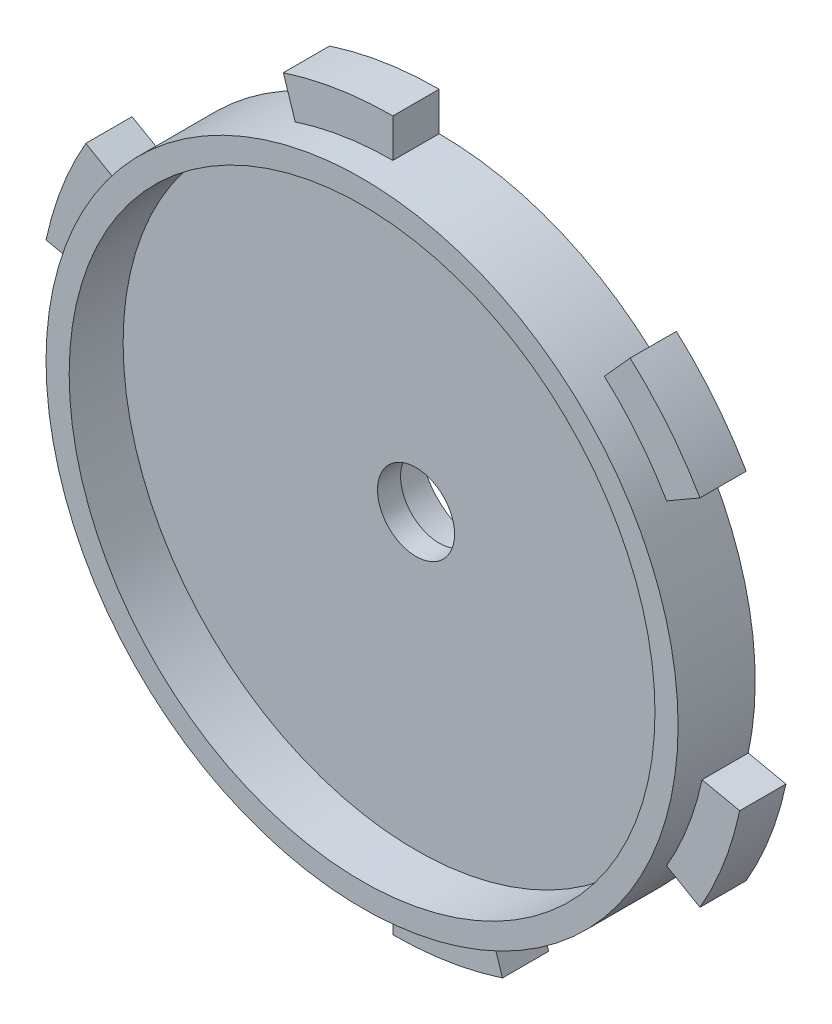
ISO-10303-21;
HEADER;
FILE_DESCRIPTION(('STEP AP214'),'2;1');
FILE_NAME('part.step','',(''),(''),'','','');
FILE_SCHEMA(('AUTOMOTIVE_DESIGN { 1 0 10303 214 1 1 1 1 }'));
ENDSEC;
DATA;
#1=APPLICATION_CONTEXT('core data for automotive mechanical design processes');
#2=APPLICATION_PROTOCOL_DEFINITION('international standard','automotive_design',2000,#1);
#3=PRODUCT_CONTEXT('',#1,'mechanical');
#4=PRODUCT('Part','Part','',(#3));
#5=PRODUCT_RELATED_PRODUCT_CATEGORY('part','',(#4));
#6=PRODUCT_DEFINITION_FORMATION('','',#4);
#7=PRODUCT_DEFINITION_CONTEXT('part definition',#1,'design');
#8=PRODUCT_DEFINITION('design','',#6,#7);
#9=PRODUCT_DEFINITION_SHAPE('','',#8);
#10=(LENGTH_UNIT() NAMED_UNIT(*) SI_UNIT(.MILLI.,.METRE.));
#11=(NAMED_UNIT(*) PLANE_ANGLE_UNIT() SI_UNIT($,.RADIAN.));
#12=(NAMED_UNIT(*) SI_UNIT($,.STERADIAN.) SOLID_ANGLE_UNIT());
#13=UNCERTAINTY_MEASURE_WITH_UNIT(LENGTH_MEASURE(1.E-05),#10,'distance_accuracy_value','');
#14=(GEOMETRIC_REPRESENTATION_CONTEXT(3) GLOBAL_UNCERTAINTY_ASSIGNED_CONTEXT((#13)) GLOBAL_UNIT_ASSIGNED_CONTEXT((#10,
#11,#12)) REPRESENTATION_CONTEXT('',''));
#15=CARTESIAN_POINT('',(0.,0.,0.));
#16=DIRECTION('',(0.,0.,1.));
#17=DIRECTION('',(1.,0.,0.));
#18=AXIS2_PLACEMENT_3D('',#15,#16,#17);
#19=CARTESIAN_POINT('',(0.,0.,0.));
#20=DIRECTION('',(0.,0.,1.));
#21=DIRECTION('',(1.,0.,0.));
#22=AXIS2_PLACEMENT_3D('',#19,#20,#21);
#23=PLANE('',#22);
#24=CARTESIAN_POINT('',(0.,0.,0.));
#25=DIRECTION('',(0.,0.,1.));
#26=DIRECTION('',(1.,0.,0.));
#27=AXIS2_PLACEMENT_3D('',#24,#25,#26);
#28=CIRCLE('',#27,5.);
#29=CARTESIAN_POINT('',(5.,0.,0.));
#30=VERTEX_POINT('',#29);
#31=EDGE_CURVE('E392',#30,#30,#28,.F.);
#32=ORIENTED_EDGE('',*,*,#31,.F.);
#33=EDGE_LOOP('',(#32));
#34=FACE_BOUND('',#33,.T.);
#35=CARTESIAN_POINT('',(0.,0.,0.));
#36=DIRECTION('',(0.,0.,-1.));
#37=DIRECTION('',(-1.,0.,0.));
#38=AXIS2_PLACEMENT_3D('',#35,#36,#37);
#39=CIRCLE('',#38,8.);
#40=CARTESIAN_POINT('',(-8.,0.,0.));
#41=VERTEX_POINT('',#40);
#42=EDGE_CURVE('E376',#41,#41,#39,.T.);
#43=ORIENTED_EDGE('',*,*,#42,.T.);
#44=EDGE_LOOP('',(#43));
#45=FACE_BOUND('',#44,.T.);
#46=ADVANCED_FACE('F37',(#34,#45),#23,.F.);
#47=CARTESIAN_POINT('',(0.,0.,10.));
#48=DIRECTION('',(0.,0.,-1.));
#49=DIRECTION('',(-1.,0.,0.));
#50=AXIS2_PLACEMENT_3D('',#47,#48,#49);
#51=CYLINDRICAL_SURFACE('',#50,41.);
#52=CARTESIAN_POINT('',(0.,0.,0.));
#53=DIRECTION('',(0.,0.,1.));
#54=DIRECTION('',(1.,0.,0.));
#55=AXIS2_PLACEMENT_3D('',#52,#53,#54);
#56=CIRCLE('',#55,41.);
#57=CARTESIAN_POINT('',(40.1040516300861,-8.52437932352774,0.));
#58=VERTEX_POINT('',#57);
#59=CARTESIAN_POINT('',(35.5070415551618,20.5000000000004,0.));
#60=VERTEX_POINT('',#59);
#61=EDGE_CURVE('E692',#58,#60,#56,.T.);
#62=ORIENTED_EDGE('',*,*,#61,.T.);
#63=DIRECTION('',(0.,0.,-1.));
#64=VECTOR('',#63,1.);
#65=CARTESIAN_POINT('',(35.5070415551617,20.5000000000004,6.));
#66=LINE('',#65,#64);
#67=CARTESIAN_POINT('',(35.5070415551617,20.5000000000004,6.));
#68=VERTEX_POINT('',#67);
#69=EDGE_CURVE('E57',#68,#60,#66,.T.);
#70=ORIENTED_EDGE('',*,*,#69,.F.);
#71=CARTESIAN_POINT('',(0.,0.,6.));
#72=DIRECTION('',(0.,0.,1.));
#73=DIRECTION('',(1.,0.,0.));
#74=AXIS2_PLACEMENT_3D('',#71,#72,#73);
#75=CIRCLE('',#74,41.);
#76=CARTESIAN_POINT('',(27.4343548607128,30.4689378445735,6.));
#77=VERTEX_POINT('',#76);
#78=EDGE_CURVE('E52',#68,#77,#75,.T.);
#79=ORIENTED_EDGE('',*,*,#78,.T.);
#80=DIRECTION('',(0.,0.,-1.));
#81=VECTOR('',#80,1.);
#82=CARTESIAN_POINT('',(27.4343548607128,30.4689378445735,6.));
#83=LINE('',#82,#81);
#84=CARTESIAN_POINT('',(27.4343548607128,30.4689378445735,0.));
#85=VERTEX_POINT('',#84);
#86=EDGE_CURVE('E209',#77,#85,#83,.T.);
#87=ORIENTED_EDGE('',*,*,#86,.T.);
#88=CARTESIAN_POINT('',(0.,41.,0.));
#89=VERTEX_POINT('',#88);
#90=EDGE_CURVE('E401',#85,#89,#56,.T.);
#91=ORIENTED_EDGE('',*,*,#90,.T.);
#92=DIRECTION('',(0.,0.,-1.));
#93=VECTOR('',#92,1.);
#94=CARTESIAN_POINT('',(0.,41.,6.));
#95=LINE('',#94,#93);
#96=CARTESIAN_POINT('',(0.,41.,6.));
#97=VERTEX_POINT('',#96);
#98=EDGE_CURVE('E373',#97,#89,#95,.T.);
#99=ORIENTED_EDGE('',*,*,#98,.F.);
#100=CARTESIAN_POINT('',(0.,0.,6.));
#101=DIRECTION('',(0.,0.,1.));
#102=DIRECTION('',(1.,0.,0.));
#103=AXIS2_PLACEMENT_3D('',#100,#101,#102);
#104=CIRCLE('',#103,41.);
#105=CARTESIAN_POINT('',(-12.6696967693729,38.9933171681013,6.));
#106=VERTEX_POINT('',#105);
#107=EDGE_CURVE('E353',#97,#106,#104,.T.);
#108=ORIENTED_EDGE('',*,*,#107,.T.);
#109=DIRECTION('',(0.,0.,-1.));
#110=VECTOR('',#109,1.);
#111=CARTESIAN_POINT('',(-12.6696967693729,38.9933171681013,6.));
#112=LINE('',#111,#110);
#113=CARTESIAN_POINT('',(-12.6696967693729,38.9933171681013,0.));
#114=VERTEX_POINT('',#113);
#115=EDGE_CURVE('E365',#106,#114,#112,.T.);
#116=ORIENTED_EDGE('',*,*,#115,.T.);
#117=CARTESIAN_POINT('',(-35.507041555162,20.5,0.));
#118=VERTEX_POINT('',#117);
#119=EDGE_CURVE('E404',#114,#118,#56,.T.);
#120=ORIENTED_EDGE('',*,*,#119,.T.);
#121=DIRECTION('',(0.,0.,-1.));
#122=VECTOR('',#121,1.);
#123=CARTESIAN_POINT('',(-35.507041555162,20.4999999999999,6.));
#124=LINE('',#123,#122);
#125=CARTESIAN_POINT('',(-35.507041555162,20.4999999999999,6.));
#126=VERTEX_POINT('',#125);
#127=EDGE_CURVE('E343',#126,#118,#124,.T.);
#128=ORIENTED_EDGE('',*,*,#127,.F.);
#129=CARTESIAN_POINT('',(0.,0.,6.));
#130=DIRECTION('',(0.,0.,1.));
#131=DIRECTION('',(1.,0.,0.));
#132=AXIS2_PLACEMENT_3D('',#129,#130,#131);
#133=CIRCLE('',#132,41.);
#134=CARTESIAN_POINT('',(-40.1040516300861,8.52437932352802,6.));
#135=VERTEX_POINT('',#134);
#136=EDGE_CURVE('E323',#126,#135,#133,.T.);
#137=ORIENTED_EDGE('',*,*,#136,.T.);
#138=DIRECTION('',(0.,0.,-1.));
#139=VECTOR('',#138,1.);
#140=CARTESIAN_POINT('',(-40.1040516300861,8.52437932352802,6.));
#141=LINE('',#140,#139);
#142=CARTESIAN_POINT('',(-40.1040516300861,8.52437932352802,0.));
#143=VERTEX_POINT('',#142);
#144=EDGE_CURVE('E335',#135,#143,#141,.T.);
#145=ORIENTED_EDGE('',*,*,#144,.T.);
#146=CARTESIAN_POINT('',(-35.5070415551619,-20.5000000000001,0.));
#147=VERTEX_POINT('',#146);
#148=EDGE_CURVE('E405',#143,#147,#56,.T.);
#149=ORIENTED_EDGE('',*,*,#148,.T.);
#150=DIRECTION('',(0.,0.,-1.));
#151=VECTOR('',#150,1.);
#152=CARTESIAN_POINT('',(-35.5070415551619,-20.5000000000002,6.));
#153=LINE('',#152,#151);
#154=CARTESIAN_POINT('',(-35.5070415551619,-20.5000000000002,6.));
#155=VERTEX_POINT('',#154);
#156=EDGE_CURVE('E313',#155,#147,#153,.T.);
#157=ORIENTED_EDGE('',*,*,#156,.F.);
#158=CARTESIAN_POINT('',(0.,0.,6.));
#159=DIRECTION('',(0.,0.,1.));
#160=DIRECTION('',(1.,0.,0.));
#161=AXIS2_PLACEMENT_3D('',#158,#159,#160);
#162=CIRCLE('',#161,41.);
#163=CARTESIAN_POINT('',(-27.434354860713,-30.4689378445733,6.));
#164=VERTEX_POINT('',#163);
#165=EDGE_CURVE('E293',#155,#164,#162,.T.);
#166=ORIENTED_EDGE('',*,*,#165,.T.);
#167=DIRECTION('',(0.,0.,-1.));
#168=VECTOR('',#167,1.);
#169=CARTESIAN_POINT('',(-27.434354860713,-30.4689378445733,6.));
#170=LINE('',#169,#168);
#171=CARTESIAN_POINT('',(-27.434354860713,-30.4689378445733,0.));
#172=VERTEX_POINT('',#171);
#173=EDGE_CURVE('E305',#164,#172,#170,.T.);
#174=ORIENTED_EDGE('',*,*,#173,.T.);
#175=CARTESIAN_POINT('',(2.86301469785137E-13,-41.,0.));
#176=VERTEX_POINT('',#175);
#177=EDGE_CURVE('E694',#172,#176,#56,.T.);
#178=ORIENTED_EDGE('',*,*,#177,.T.);
#179=DIRECTION('',(0.,0.,-1.));
#180=VECTOR('',#179,1.);
#181=CARTESIAN_POINT('',(2.86301469785137E-13,-41.,6.));
#182=LINE('',#181,#180);
#183=CARTESIAN_POINT('',(2.86301469785137E-13,-41.,6.));
#184=VERTEX_POINT('',#183);
#185=EDGE_CURVE('E283',#184,#176,#182,.T.);
#186=ORIENTED_EDGE('',*,*,#185,.F.);
#187=CARTESIAN_POINT('',(0.,0.,6.));
#188=DIRECTION('',(0.,0.,1.));
#189=DIRECTION('',(1.,0.,0.));
#190=AXIS2_PLACEMENT_3D('',#187,#188,#189);
#191=CIRCLE('',#190,41.);
#192=CARTESIAN_POINT('',(12.6696967693731,-38.9933171681012,6.));
#193=VERTEX_POINT('',#192);
#194=EDGE_CURVE('E263',#184,#193,#191,.T.);
#195=ORIENTED_EDGE('',*,*,#194,.T.);
#196=DIRECTION('',(0.,0.,-1.));
#197=VECTOR('',#196,1.);
#198=CARTESIAN_POINT('',(12.6696967693731,-38.9933171681012,6.));
#199=LINE('',#198,#197);
#200=CARTESIAN_POINT('',(12.6696967693731,-38.9933171681012,0.));
#201=VERTEX_POINT('',#200);
#202=EDGE_CURVE('E275',#193,#201,#199,.T.);
#203=ORIENTED_EDGE('',*,*,#202,.T.);
#204=CARTESIAN_POINT('',(35.5070415551622,-20.4999999999997,0.));
#205=VERTEX_POINT('',#204);
#206=EDGE_CURVE('E693',#201,#205,#56,.T.);
#207=ORIENTED_EDGE('',*,*,#206,.T.);
#208=DIRECTION('',(0.,0.,-1.));
#209=VECTOR('',#208,1.);
#210=CARTESIAN_POINT('',(35.5070415551622,-20.4999999999997,6.));
#211=LINE('',#210,#209);
#212=CARTESIAN_POINT('',(35.5070415551622,-20.4999999999997,6.));
#213=VERTEX_POINT('',#212);
#214=EDGE_CURVE('E253',#213,#205,#211,.T.);
#215=ORIENTED_EDGE('',*,*,#214,.F.);
#216=CARTESIAN_POINT('',(0.,0.,6.));
#217=DIRECTION('',(0.,0.,1.));
#218=DIRECTION('',(1.,0.,0.));
#219=AXIS2_PLACEMENT_3D('',#216,#217,#218);
#220=CIRCLE('',#219,41.);
#221=CARTESIAN_POINT('',(40.1040516300861,-8.52437932352774,6.));
#222=VERTEX_POINT('',#221);
#223=EDGE_CURVE('E233',#213,#222,#220,.T.);
#224=ORIENTED_EDGE('',*,*,#223,.T.);
#225=DIRECTION('',(0.,0.,-1.));
#226=VECTOR('',#225,1.);
#227=CARTESIAN_POINT('',(40.1040516300861,-8.52437932352774,6.));
#228=LINE('',#227,#226);
#229=EDGE_CURVE('E245',#222,#58,#228,.T.);
#230=ORIENTED_EDGE('',*,*,#229,.T.);
#231=EDGE_LOOP('',(#62,#70,#79,#87,#91,#99,#108,#116,#120,#128,#137,#145,#149,#157,#166,#174,
#178,#186,#195,#203,#207,#215,#224,#230));
#232=FACE_BOUND('',#231,.T.);
#233=CARTESIAN_POINT('',(0.,0.,10.));
#234=DIRECTION('',(0.,0.,1.));
#235=DIRECTION('',(1.,0.,0.));
#236=AXIS2_PLACEMENT_3D('',#233,#234,#235);
#237=CIRCLE('',#236,41.);
#238=CARTESIAN_POINT('',(41.,0.,10.));
#239=VERTEX_POINT('',#238);
#240=EDGE_CURVE('E45',#239,#239,#237,.T.);
#241=ORIENTED_EDGE('',*,*,#240,.F.);
#242=EDGE_LOOP('',(#241));
#243=FACE_BOUND('',#242,.T.);
#244=ADVANCED_FACE('F39',(#232,#243),#51,.T.);
#245=CARTESIAN_POINT('',(0.,0.,10.));
#246=DIRECTION('',(0.,0.,1.));
#247=DIRECTION('',(1.,0.,0.));
#248=AXIS2_PLACEMENT_3D('',#245,#246,#247);
#249=PLANE('',#248);
#250=CARTESIAN_POINT('',(0.,0.,10.));
#251=DIRECTION('',(0.,0.,1.));
#252=DIRECTION('',(1.,0.,0.));
#253=AXIS2_PLACEMENT_3D('',#250,#251,#252);
#254=CIRCLE('',#253,38.);
#255=CARTESIAN_POINT('',(38.,0.,10.));
#256=VERTEX_POINT('',#255);
#257=EDGE_CURVE('E398',#256,#256,#254,.T.);
#258=ORIENTED_EDGE('',*,*,#257,.F.);
#259=EDGE_LOOP('',(#258));
#260=FACE_BOUND('',#259,.T.);
#261=ORIENTED_EDGE('',*,*,#240,.T.);
#262=EDGE_LOOP('',(#261));
#263=FACE_BOUND('',#262,.T.);
#264=ADVANCED_FACE('F452',(#260,#263),#249,.T.);
#265=CARTESIAN_POINT('',(0.,0.,0.));
#266=DIRECTION('',(0.,0.,1.));
#267=DIRECTION('',(1.,0.,0.));
#268=AXIS2_PLACEMENT_3D('',#265,#266,#267);
#269=CIRCLE('',#268,10.);
#270=CARTESIAN_POINT('',(10.,0.,0.));
#271=VERTEX_POINT('',#270);
#272=EDGE_CURVE('E11',#271,#271,#269,.F.);
#273=ORIENTED_EDGE('',*,*,#272,.F.);
#274=EDGE_LOOP('',(#273));
#275=FACE_BOUND('',#274,.T.);
#276=ORIENTED_EDGE('',*,*,#119,.F.);
#277=DIRECTION('',(-0.309016994374948,0.951056516295153,0.));
#278=VECTOR('',#277,1.);
#279=CARTESIAN_POINT('',(-14.2147817412476,43.7485997495771,0.));
#280=LINE('',#279,#278);
#281=CARTESIAN_POINT('',(-14.2147817412476,43.7485997495771,0.));
#282=VERTEX_POINT('',#281);
#283=EDGE_CURVE('E346',#114,#282,#280,.T.);
#284=ORIENTED_EDGE('',*,*,#283,.T.);
#285=CARTESIAN_POINT('',(0.,0.,0.));
#286=DIRECTION('',(0.,0.,-1.));
#287=DIRECTION('',(1.,0.,0.));
#288=AXIS2_PLACEMENT_3D('',#285,#286,#287);
#289=CIRCLE('',#288,46.);
#290=CARTESIAN_POINT('',(0.,46.,0.));
#291=VERTEX_POINT('',#290);
#292=EDGE_CURVE('E368',#282,#291,#289,.T.);
#293=ORIENTED_EDGE('',*,*,#292,.T.);
#294=DIRECTION('',(0.,-1.,0.));
#295=VECTOR('',#294,1.);
#296=CARTESIAN_POINT('',(0.,46.,0.));
#297=LINE('',#296,#295);
#298=EDGE_CURVE('E356',#291,#89,#297,.T.);
#299=ORIENTED_EDGE('',*,*,#298,.T.);
#300=ORIENTED_EDGE('',*,*,#90,.F.);
#301=DIRECTION('',(0.66913060635885,0.743144825477402,0.));
#302=VECTOR('',#301,1.);
#303=CARTESIAN_POINT('',(30.7800078925071,34.1846619719605,0.));
#304=LINE('',#303,#302);
#305=CARTESIAN_POINT('',(30.7800078925071,34.1846619719605,0.));
#306=VERTEX_POINT('',#305);
#307=EDGE_CURVE('E224',#85,#306,#304,.T.);
#308=ORIENTED_EDGE('',*,*,#307,.T.);
#309=CARTESIAN_POINT('',(0.,0.,0.));
#310=DIRECTION('',(0.,0.,-1.));
#311=DIRECTION('',(1.,0.,0.));
#312=AXIS2_PLACEMENT_3D('',#309,#310,#311);
#313=CIRCLE('',#312,46.);
#314=CARTESIAN_POINT('',(39.8371685740839,23.0000000000005,0.));
#315=VERTEX_POINT('',#314);
#316=EDGE_CURVE('E203',#306,#315,#313,.T.);
#317=ORIENTED_EDGE('',*,*,#316,.T.);
#318=DIRECTION('',(-0.866025403784433,-0.50000000000001,0.));
#319=VECTOR('',#318,1.);
#320=CARTESIAN_POINT('',(39.8371685740839,23.0000000000005,0.));
#321=LINE('',#320,#319);
#322=EDGE_CURVE('E220',#315,#60,#321,.T.);
#323=ORIENTED_EDGE('',*,*,#322,.T.);
#324=ORIENTED_EDGE('',*,*,#61,.F.);
#325=DIRECTION('',(0.978147600733808,-0.20791169081775,0.));
#326=VECTOR('',#325,1.);
#327=CARTESIAN_POINT('',(44.9947896337552,-9.56393777761648,0.));
#328=LINE('',#327,#326);
#329=CARTESIAN_POINT('',(44.9947896337551,-9.56393777761651,0.));
#330=VERTEX_POINT('',#329);
#331=EDGE_CURVE('E230',#58,#330,#328,.T.);
#332=ORIENTED_EDGE('',*,*,#331,.T.);
#333=CARTESIAN_POINT('',(0.,0.,0.));
#334=DIRECTION('',(0.,0.,-1.));
#335=DIRECTION('',(1.,0.,0.));
#336=AXIS2_PLACEMENT_3D('',#333,#334,#335);
#337=CIRCLE('',#336,46.);
#338=CARTESIAN_POINT('',(39.8371685740844,-22.9999999999996,0.));
#339=VERTEX_POINT('',#338);
#340=EDGE_CURVE('E248',#330,#339,#337,.T.);
#341=ORIENTED_EDGE('',*,*,#340,.T.);
#342=DIRECTION('',(-0.866025403784443,0.499999999999992,0.));
#343=VECTOR('',#342,1.);
#344=CARTESIAN_POINT('',(39.8371685740844,-22.9999999999996,0.));
#345=LINE('',#344,#343);
#346=EDGE_CURVE('E236',#339,#205,#345,.T.);
#347=ORIENTED_EDGE('',*,*,#346,.T.);
#348=ORIENTED_EDGE('',*,*,#206,.F.);
#349=DIRECTION('',(0.309016994374955,-0.951056516295151,0.));
#350=VECTOR('',#349,1.);
#351=CARTESIAN_POINT('',(14.2147817412479,-43.748599749577,0.));
#352=LINE('',#351,#350);
#353=CARTESIAN_POINT('',(14.2147817412479,-43.748599749577,0.));
#354=VERTEX_POINT('',#353);
#355=EDGE_CURVE('E256',#201,#354,#352,.T.);
#356=ORIENTED_EDGE('',*,*,#355,.T.);
#357=CARTESIAN_POINT('',(0.,0.,0.));
#358=DIRECTION('',(0.,0.,-1.));
#359=DIRECTION('',(1.,0.,0.));
#360=AXIS2_PLACEMENT_3D('',#357,#358,#359);
#361=CIRCLE('',#360,46.);
#362=CARTESIAN_POINT('',(3.21216283173568E-13,-46.,0.));
#363=VERTEX_POINT('',#362);
#364=EDGE_CURVE('E278',#354,#363,#361,.T.);
#365=ORIENTED_EDGE('',*,*,#364,.T.);
#366=DIRECTION('',(0.,1.,0.));
#367=VECTOR('',#366,1.);
#368=CARTESIAN_POINT('',(3.21216283173568E-13,-46.,0.));
#369=LINE('',#368,#367);
#370=EDGE_CURVE('E266',#363,#176,#369,.T.);
#371=ORIENTED_EDGE('',*,*,#370,.T.);
#372=ORIENTED_EDGE('',*,*,#177,.F.);
#373=DIRECTION('',(-0.669130606358855,-0.743144825477397,0.));
#374=VECTOR('',#373,1.);
#375=CARTESIAN_POINT('',(-30.7800078925073,-34.1846619719603,0.));
#376=LINE('',#375,#374);
#377=CARTESIAN_POINT('',(-30.7800078925073,-34.1846619719603,0.));
#378=VERTEX_POINT('',#377);
#379=EDGE_CURVE('E286',#172,#378,#376,.T.);
#380=ORIENTED_EDGE('',*,*,#379,.T.);
#381=CARTESIAN_POINT('',(0.,0.,0.));
#382=DIRECTION('',(0.,0.,-1.));
#383=DIRECTION('',(1.,0.,0.));
#384=AXIS2_PLACEMENT_3D('',#381,#382,#383);
#385=CIRCLE('',#384,46.);
#386=CARTESIAN_POINT('',(-39.8371685740841,-23.0000000000002,0.));
#387=VERTEX_POINT('',#386);
#388=EDGE_CURVE('E308',#378,#387,#385,.T.);
#389=ORIENTED_EDGE('',*,*,#388,.T.);
#390=DIRECTION('',(0.866025403784437,0.500000000000004,0.));
#391=VECTOR('',#390,1.);
#392=CARTESIAN_POINT('',(-39.8371685740841,-23.0000000000002,0.));
#393=LINE('',#392,#391);
#394=EDGE_CURVE('E296',#387,#147,#393,.T.);
#395=ORIENTED_EDGE('',*,*,#394,.T.);
#396=ORIENTED_EDGE('',*,*,#148,.F.);
#397=DIRECTION('',(-0.978147600733806,0.207911690817756,0.));
#398=VECTOR('',#397,1.);
#399=CARTESIAN_POINT('',(-44.9947896337551,9.5639377776168,0.));
#400=LINE('',#399,#398);
#401=CARTESIAN_POINT('',(-44.9947896337551,9.56393777761679,0.));
#402=VERTEX_POINT('',#401);
#403=EDGE_CURVE('E316',#143,#402,#400,.T.);
#404=ORIENTED_EDGE('',*,*,#403,.T.);
#405=CARTESIAN_POINT('',(0.,0.,0.));
#406=DIRECTION('',(0.,0.,-1.));
#407=DIRECTION('',(1.,0.,0.));
#408=AXIS2_PLACEMENT_3D('',#405,#406,#407);
#409=CIRCLE('',#408,46.);
#410=CARTESIAN_POINT('',(-39.8371685740842,22.9999999999999,0.));
#411=VERTEX_POINT('',#410);
#412=EDGE_CURVE('E338',#402,#411,#409,.T.);
#413=ORIENTED_EDGE('',*,*,#412,.T.);
#414=DIRECTION('',(0.866025403784439,-0.499999999999999,0.));
#415=VECTOR('',#414,1.);
#416=CARTESIAN_POINT('',(-39.8371685740842,22.9999999999999,0.));
#417=LINE('',#416,#415);
#418=EDGE_CURVE('E326',#411,#118,#417,.T.);
#419=ORIENTED_EDGE('',*,*,#418,.T.);
#420=EDGE_LOOP('',(#276,#284,#293,#299,#300,#308,#317,#323,#324,#332,#341,#347,#348,#356,#365,
#371,#372,#380,#389,#395,#396,#404,#413,#419));
#421=FACE_BOUND('',#420,.T.);
#422=ADVANCED_FACE('F421',(#275,#421),#23,.F.);
#423=CARTESIAN_POINT('',(0.,0.,10.));
#424=DIRECTION('',(0.,0.,-1.));
#425=DIRECTION('',(-1.,0.,0.));
#426=AXIS2_PLACEMENT_3D('',#423,#424,#425);
#427=CYLINDRICAL_SURFACE('',#426,38.);
#428=ORIENTED_EDGE('',*,*,#257,.T.);
#429=EDGE_LOOP('',(#428));
#430=FACE_BOUND('',#429,.T.);
#431=CARTESIAN_POINT('',(0.,0.,3.));
#432=DIRECTION('',(0.,0.,1.));
#433=DIRECTION('',(1.,0.,0.));
#434=AXIS2_PLACEMENT_3D('',#431,#432,#433);
#435=CIRCLE('',#434,38.);
#436=CARTESIAN_POINT('',(38.,0.,3.));
#437=VERTEX_POINT('',#436);
#438=EDGE_CURVE('E395',#437,#437,#435,.T.);
#439=ORIENTED_EDGE('',*,*,#438,.F.);
#440=EDGE_LOOP('',(#439));
#441=FACE_BOUND('',#440,.T.);
#442=ADVANCED_FACE('F446',(#430,#441),#427,.F.);
#443=CARTESIAN_POINT('',(0.,0.,3.));
#444=DIRECTION('',(0.,0.,1.));
#445=DIRECTION('',(1.,0.,0.));
#446=AXIS2_PLACEMENT_3D('',#443,#444,#445);
#447=PLANE('',#446);
#448=CARTESIAN_POINT('',(0.,0.,3.));
#449=DIRECTION('',(0.,0.,1.));
#450=DIRECTION('',(1.,0.,0.));
#451=AXIS2_PLACEMENT_3D('',#448,#449,#450);
#452=CIRCLE('',#451,5.);
#453=CARTESIAN_POINT('',(5.,0.,3.));
#454=VERTEX_POINT('',#453);
#455=EDGE_CURVE('E391',#454,#454,#452,.F.);
#456=ORIENTED_EDGE('',*,*,#455,.T.);
#457=EDGE_LOOP('',(#456));
#458=FACE_BOUND('',#457,.T.);
#459=ORIENTED_EDGE('',*,*,#438,.T.);
#460=EDGE_LOOP('',(#459));
#461=FACE_BOUND('',#460,.T.);
#462=ADVANCED_FACE('F409',(#458,#461),#447,.T.);
#463=CARTESIAN_POINT('',(0.,0.,10.));
#464=DIRECTION('',(0.,0.,-1.));
#465=DIRECTION('',(-1.,0.,0.));
#466=AXIS2_PLACEMENT_3D('',#463,#464,#465);
#467=CYLINDRICAL_SURFACE('',#466,5.);
#468=ORIENTED_EDGE('',*,*,#455,.F.);
#469=EDGE_LOOP('',(#468));
#470=FACE_BOUND('',#469,.T.);
#471=ORIENTED_EDGE('',*,*,#31,.T.);
#472=EDGE_LOOP('',(#471));
#473=FACE_BOUND('',#472,.T.);
#474=ADVANCED_FACE('F412',(#470,#473),#467,.F.);
#475=CARTESIAN_POINT('',(0.,0.,-5.5));
#476=DIRECTION('',(0.,0.,-1.));
#477=DIRECTION('',(-1.,0.,0.));
#478=AXIS2_PLACEMENT_3D('',#475,#476,#477);
#479=PLANE('',#478);
#480=CARTESIAN_POINT('',(0.,0.,-5.5));
#481=DIRECTION('',(0.,0.,-1.));
#482=DIRECTION('',(-1.,0.,0.));
#483=AXIS2_PLACEMENT_3D('',#480,#481,#482);
#484=CIRCLE('',#483,10.);
#485=CARTESIAN_POINT('',(-10.,0.,-5.5));
#486=VERTEX_POINT('',#485);
#487=EDGE_CURVE('E386',#486,#486,#484,.T.);
#488=ORIENTED_EDGE('',*,*,#487,.T.);
#489=EDGE_LOOP('',(#488));
#490=FACE_BOUND('',#489,.T.);
#491=CARTESIAN_POINT('',(0.,0.,-5.5));
#492=DIRECTION('',(0.,0.,-1.));
#493=DIRECTION('',(-1.,0.,0.));
#494=AXIS2_PLACEMENT_3D('',#491,#492,#493);
#495=CIRCLE('',#494,8.);
#496=CARTESIAN_POINT('',(-8.,0.,-5.5));
#497=VERTEX_POINT('',#496);
#498=EDGE_CURVE('E383',#497,#497,#495,.T.);
#499=ORIENTED_EDGE('',*,*,#498,.F.);
#500=EDGE_LOOP('',(#499));
#501=FACE_BOUND('',#500,.T.);
#502=ADVANCED_FACE('F415',(#490,#501),#479,.T.);
#503=CARTESIAN_POINT('',(0.,0.,-5.5));
#504=DIRECTION('',(0.,0.,1.));
#505=DIRECTION('',(1.,0.,0.));
#506=AXIS2_PLACEMENT_3D('',#503,#504,#505);
#507=CYLINDRICAL_SURFACE('',#506,10.);
#508=ORIENTED_EDGE('',*,*,#487,.F.);
#509=EDGE_LOOP('',(#508));
#510=FACE_BOUND('',#509,.T.);
#511=ORIENTED_EDGE('',*,*,#272,.T.);
#512=EDGE_LOOP('',(#511));
#513=FACE_BOUND('',#512,.T.);
#514=ADVANCED_FACE('F427',(#510,#513),#507,.T.);
#515=CARTESIAN_POINT('',(0.,0.,-5.5));
#516=DIRECTION('',(0.,0.,1.));
#517=DIRECTION('',(1.,0.,0.));
#518=AXIS2_PLACEMENT_3D('',#515,#516,#517);
#519=CYLINDRICAL_SURFACE('',#518,8.);
#520=ORIENTED_EDGE('',*,*,#498,.T.);
#521=EDGE_LOOP('',(#520));
#522=FACE_BOUND('',#521,.T.);
#523=ORIENTED_EDGE('',*,*,#42,.F.);
#524=EDGE_LOOP('',(#523));
#525=FACE_BOUND('',#524,.T.);
#526=ADVANCED_FACE('F424',(#522,#525),#519,.F.);
#527=CARTESIAN_POINT('',(0.,46.,6.));
#528=DIRECTION('',(1.,0.,0.));
#529=DIRECTION('',(0.,0.,-1.));
#530=AXIS2_PLACEMENT_3D('',#527,#528,#529);
#531=PLANE('',#530);
#532=ORIENTED_EDGE('',*,*,#298,.F.);
#533=DIRECTION('',(0.,0.,-1.));
#534=VECTOR('',#533,1.);
#535=CARTESIAN_POINT('',(0.,46.,6.));
#536=LINE('',#535,#534);
#537=CARTESIAN_POINT('',(0.,46.,6.));
#538=VERTEX_POINT('',#537);
#539=EDGE_CURVE('E377',#538,#291,#536,.T.);
#540=ORIENTED_EDGE('',*,*,#539,.F.);
#541=DIRECTION('',(0.,-1.,0.));
#542=VECTOR('',#541,1.);
#543=CARTESIAN_POINT('',(0.,46.,6.));
#544=LINE('',#543,#542);
#545=EDGE_CURVE('E362',#538,#97,#544,.T.);
#546=ORIENTED_EDGE('',*,*,#545,.T.);
#547=ORIENTED_EDGE('',*,*,#98,.T.);
#548=EDGE_LOOP('',(#532,#540,#546,#547));
#549=FACE_BOUND('',#548,.T.);
#550=ADVANCED_FACE('F426',(#549),#531,.T.);
#551=CARTESIAN_POINT('',(0.,0.,6.));
#552=DIRECTION('',(0.,0.,-1.));
#553=DIRECTION('',(-1.,0.,0.));
#554=AXIS2_PLACEMENT_3D('',#551,#552,#553);
#555=CYLINDRICAL_SURFACE('',#554,46.);
#556=ORIENTED_EDGE('',*,*,#292,.F.);
#557=DIRECTION('',(0.,0.,-1.));
#558=VECTOR('',#557,1.);
#559=CARTESIAN_POINT('',(-14.2147817412476,43.7485997495771,6.));
#560=LINE('',#559,#558);
#561=CARTESIAN_POINT('',(-14.2147817412476,43.7485997495771,6.));
#562=VERTEX_POINT('',#561);
#563=EDGE_CURVE('E379',#562,#282,#560,.T.);
#564=ORIENTED_EDGE('',*,*,#563,.F.);
#565=CARTESIAN_POINT('',(0.,0.,6.));
#566=DIRECTION('',(0.,0.,-1.));
#567=DIRECTION('',(1.,0.,0.));
#568=AXIS2_PLACEMENT_3D('',#565,#566,#567);
#569=CIRCLE('',#568,46.);
#570=EDGE_CURVE('E359',#562,#538,#569,.T.);
#571=ORIENTED_EDGE('',*,*,#570,.T.);
#572=ORIENTED_EDGE('',*,*,#539,.T.);
#573=EDGE_LOOP('',(#556,#564,#571,#572));
#574=FACE_BOUND('',#573,.T.);
#575=ADVANCED_FACE('F434',(#574),#555,.T.);
#576=CARTESIAN_POINT('',(-14.2147817412476,43.7485997495771,6.));
#577=DIRECTION('',(-0.951056516295153,-0.309016994374948,0.));
#578=DIRECTION('',(0.309016994374948,-0.951056516295153,0.));
#579=AXIS2_PLACEMENT_3D('',#576,#577,#578);
#580=PLANE('',#579);
#581=ORIENTED_EDGE('',*,*,#283,.F.);
#582=ORIENTED_EDGE('',*,*,#115,.F.);
#583=DIRECTION('',(-0.309016994374948,0.951056516295153,0.));
#584=VECTOR('',#583,1.);
#585=CARTESIAN_POINT('',(-14.2147817412476,43.7485997495771,6.));
#586=LINE('',#585,#584);
#587=EDGE_CURVE('E355',#106,#562,#586,.T.);
#588=ORIENTED_EDGE('',*,*,#587,.T.);
#589=ORIENTED_EDGE('',*,*,#563,.T.);
#590=EDGE_LOOP('',(#581,#582,#588,#589));
#591=FACE_BOUND('',#590,.T.);
#592=ADVANCED_FACE('F441',(#591),#580,.T.);
#593=CARTESIAN_POINT('',(0.,0.,6.));
#594=DIRECTION('',(0.,0.,1.));
#595=DIRECTION('',(1.,0.,0.));
#596=AXIS2_PLACEMENT_3D('',#593,#594,#595);
#597=PLANE('',#596);
#598=ORIENTED_EDGE('',*,*,#107,.F.);
#599=ORIENTED_EDGE('',*,*,#545,.F.);
#600=ORIENTED_EDGE('',*,*,#570,.F.);
#601=ORIENTED_EDGE('',*,*,#587,.F.);
#602=EDGE_LOOP('',(#598,#599,#600,#601));
#603=FACE_BOUND('',#602,.T.);
#604=ADVANCED_FACE('F474',(#603),#597,.T.);
#605=CARTESIAN_POINT('',(-39.8371685740842,22.9999999999999,6.));
#606=DIRECTION('',(0.499999999999999,0.866025403784439,0.));
#607=DIRECTION('',(-0.866025403784439,0.499999999999999,0.));
#608=AXIS2_PLACEMENT_3D('',#605,#606,#607);
#609=PLANE('',#608);
#610=ORIENTED_EDGE('',*,*,#418,.F.);
#611=DIRECTION('',(0.,0.,-1.));
#612=VECTOR('',#611,1.);
#613=CARTESIAN_POINT('',(-39.8371685740842,22.9999999999999,6.));
#614=LINE('',#613,#612);
#615=CARTESIAN_POINT('',(-39.8371685740842,22.9999999999999,6.));
#616=VERTEX_POINT('',#615);
#617=EDGE_CURVE('E347',#616,#411,#614,.T.);
#618=ORIENTED_EDGE('',*,*,#617,.F.);
#619=DIRECTION('',(0.866025403784439,-0.499999999999999,0.));
#620=VECTOR('',#619,1.);
#621=CARTESIAN_POINT('',(-39.8371685740842,22.9999999999999,6.));
#622=LINE('',#621,#620);
#623=EDGE_CURVE('E332',#616,#126,#622,.T.);
#624=ORIENTED_EDGE('',*,*,#623,.T.);
#625=ORIENTED_EDGE('',*,*,#127,.T.);
#626=EDGE_LOOP('',(#610,#618,#624,#625));
#627=FACE_BOUND('',#626,.T.);
#628=ADVANCED_FACE('F476',(#627),#609,.T.);
#629=CARTESIAN_POINT('',(0.,0.,6.));
#630=DIRECTION('',(0.,0.,-1.));
#631=DIRECTION('',(-1.,0.,0.));
#632=AXIS2_PLACEMENT_3D('',#629,#630,#631);
#633=CYLINDRICAL_SURFACE('',#632,46.);
#634=ORIENTED_EDGE('',*,*,#412,.F.);
#635=DIRECTION('',(0.,0.,-1.));
#636=VECTOR('',#635,1.);
#637=CARTESIAN_POINT('',(-44.9947896337551,9.56393777761679,6.));
#638=LINE('',#637,#636);
#639=CARTESIAN_POINT('',(-44.9947896337551,9.56393777761679,6.));
#640=VERTEX_POINT('',#639);
#641=EDGE_CURVE('E349',#640,#402,#638,.T.);
#642=ORIENTED_EDGE('',*,*,#641,.F.);
#643=CARTESIAN_POINT('',(0.,0.,6.));
#644=DIRECTION('',(0.,0.,-1.));
#645=DIRECTION('',(1.,0.,0.));
#646=AXIS2_PLACEMENT_3D('',#643,#644,#645);
#647=CIRCLE('',#646,46.);
#648=EDGE_CURVE('E329',#640,#616,#647,.T.);
#649=ORIENTED_EDGE('',*,*,#648,.T.);
#650=ORIENTED_EDGE('',*,*,#617,.T.);
#651=EDGE_LOOP('',(#634,#642,#649,#650));
#652=FACE_BOUND('',#651,.T.);
#653=ADVANCED_FACE('F482',(#652),#633,.T.);
#654=CARTESIAN_POINT('',(-44.9947896337551,9.5639377776168,6.));
#655=DIRECTION('',(-0.207911690817756,-0.978147600733806,0.));
#656=DIRECTION('',(0.978147600733806,-0.207911690817756,0.));
#657=AXIS2_PLACEMENT_3D('',#654,#655,#656);
#658=PLANE('',#657);
#659=ORIENTED_EDGE('',*,*,#403,.F.);
#660=ORIENTED_EDGE('',*,*,#144,.F.);
#661=DIRECTION('',(-0.978147600733806,0.207911690817756,0.));
#662=VECTOR('',#661,1.);
#663=CARTESIAN_POINT('',(-44.9947896337551,9.5639377776168,6.));
#664=LINE('',#663,#662);
#665=EDGE_CURVE('E325',#135,#640,#664,.T.);
#666=ORIENTED_EDGE('',*,*,#665,.T.);
#667=ORIENTED_EDGE('',*,*,#641,.T.);
#668=EDGE_LOOP('',(#659,#660,#666,#667));
#669=FACE_BOUND('',#668,.T.);
#670=ADVANCED_FACE('F486',(#669),#658,.T.);
#671=CARTESIAN_POINT('',(0.,0.,6.));
#672=DIRECTION('',(0.,0.,1.));
#673=DIRECTION('',(1.,0.,0.));
#674=AXIS2_PLACEMENT_3D('',#671,#672,#673);
#675=PLANE('',#674);
#676=ORIENTED_EDGE('',*,*,#136,.F.);
#677=ORIENTED_EDGE('',*,*,#623,.F.);
#678=ORIENTED_EDGE('',*,*,#648,.F.);
#679=ORIENTED_EDGE('',*,*,#665,.F.);
#680=EDGE_LOOP('',(#676,#677,#678,#679));
#681=FACE_BOUND('',#680,.T.);
#682=ADVANCED_FACE('F524',(#681),#675,.T.);
#683=CARTESIAN_POINT('',(-39.8371685740841,-23.0000000000002,6.));
#684=DIRECTION('',(-0.500000000000004,0.866025403784436,0.));
#685=DIRECTION('',(-0.866025403784437,-0.500000000000004,0.));
#686=AXIS2_PLACEMENT_3D('',#683,#684,#685);
#687=PLANE('',#686);
#688=ORIENTED_EDGE('',*,*,#394,.F.);
#689=DIRECTION('',(0.,0.,-1.));
#690=VECTOR('',#689,1.);
#691=CARTESIAN_POINT('',(-39.8371685740841,-23.0000000000002,6.));
#692=LINE('',#691,#690);
#693=CARTESIAN_POINT('',(-39.8371685740841,-23.0000000000002,6.));
#694=VERTEX_POINT('',#693);
#695=EDGE_CURVE('E317',#694,#387,#692,.T.);
#696=ORIENTED_EDGE('',*,*,#695,.F.);
#697=DIRECTION('',(0.866025403784437,0.500000000000004,0.));
#698=VECTOR('',#697,1.);
#699=CARTESIAN_POINT('',(-39.8371685740841,-23.0000000000002,6.));
#700=LINE('',#699,#698);
#701=EDGE_CURVE('E302',#694,#155,#700,.T.);
#702=ORIENTED_EDGE('',*,*,#701,.T.);
#703=ORIENTED_EDGE('',*,*,#156,.T.);
#704=EDGE_LOOP('',(#688,#696,#702,#703));
#705=FACE_BOUND('',#704,.T.);
#706=ADVANCED_FACE('F533',(#705),#687,.T.);
#707=CARTESIAN_POINT('',(0.,0.,6.));
#708=DIRECTION('',(0.,0.,-1.));
#709=DIRECTION('',(-1.,0.,0.));
#710=AXIS2_PLACEMENT_3D('',#707,#708,#709);
#711=CYLINDRICAL_SURFACE('',#710,46.);
#712=ORIENTED_EDGE('',*,*,#388,.F.);
#713=DIRECTION('',(0.,0.,-1.));
#714=VECTOR('',#713,1.);
#715=CARTESIAN_POINT('',(-30.7800078925073,-34.1846619719603,6.));
#716=LINE('',#715,#714);
#717=CARTESIAN_POINT('',(-30.7800078925073,-34.1846619719603,6.));
#718=VERTEX_POINT('',#717);
#719=EDGE_CURVE('E319',#718,#378,#716,.T.);
#720=ORIENTED_EDGE('',*,*,#719,.F.);
#721=CARTESIAN_POINT('',(0.,0.,6.));
#722=DIRECTION('',(0.,0.,-1.));
#723=DIRECTION('',(1.,0.,0.));
#724=AXIS2_PLACEMENT_3D('',#721,#722,#723);
#725=CIRCLE('',#724,46.);
#726=EDGE_CURVE('E299',#718,#694,#725,.T.);
#727=ORIENTED_EDGE('',*,*,#726,.T.);
#728=ORIENTED_EDGE('',*,*,#695,.T.);
#729=EDGE_LOOP('',(#712,#720,#727,#728));
#730=FACE_BOUND('',#729,.T.);
#731=ADVANCED_FACE('F543',(#730),#711,.T.);
#732=CARTESIAN_POINT('',(-30.7800078925073,-34.1846619719603,6.));
#733=DIRECTION('',(0.743144825477397,-0.669130606358855,0.));
#734=DIRECTION('',(0.669130606358855,0.743144825477397,0.));
#735=AXIS2_PLACEMENT_3D('',#732,#733,#734);
#736=PLANE('',#735);
#737=ORIENTED_EDGE('',*,*,#379,.F.);
#738=ORIENTED_EDGE('',*,*,#173,.F.);
#739=DIRECTION('',(-0.669130606358855,-0.743144825477397,0.));
#740=VECTOR('',#739,1.);
#741=CARTESIAN_POINT('',(-30.7800078925073,-34.1846619719603,6.));
#742=LINE('',#741,#740);
#743=EDGE_CURVE('E295',#164,#718,#742,.T.);
#744=ORIENTED_EDGE('',*,*,#743,.T.);
#745=ORIENTED_EDGE('',*,*,#719,.T.);
#746=EDGE_LOOP('',(#737,#738,#744,#745));
#747=FACE_BOUND('',#746,.T.);
#748=ADVANCED_FACE('F553',(#747),#736,.T.);
#749=CARTESIAN_POINT('',(0.,0.,6.));
#750=DIRECTION('',(0.,0.,1.));
#751=DIRECTION('',(1.,0.,0.));
#752=AXIS2_PLACEMENT_3D('',#749,#750,#751);
#753=PLANE('',#752);
#754=ORIENTED_EDGE('',*,*,#165,.F.);
#755=ORIENTED_EDGE('',*,*,#701,.F.);
#756=ORIENTED_EDGE('',*,*,#726,.F.);
#757=ORIENTED_EDGE('',*,*,#743,.F.);
#758=EDGE_LOOP('',(#754,#755,#756,#757));
#759=FACE_BOUND('',#758,.T.);
#760=ADVANCED_FACE('F563',(#759),#753,.T.);
#761=CARTESIAN_POINT('',(3.21216283173568E-13,-46.,6.));
#762=DIRECTION('',(-1.,0.,0.));
#763=DIRECTION('',(0.,-1.,0.));
#764=AXIS2_PLACEMENT_3D('',#761,#762,#763);
#765=PLANE('',#764);
#766=ORIENTED_EDGE('',*,*,#370,.F.);
#767=DIRECTION('',(0.,0.,-1.));
#768=VECTOR('',#767,1.);
#769=CARTESIAN_POINT('',(3.21216283173568E-13,-46.,6.));
#770=LINE('',#769,#768);
#771=CARTESIAN_POINT('',(3.21216283173568E-13,-46.,6.));
#772=VERTEX_POINT('',#771);
#773=EDGE_CURVE('E287',#772,#363,#770,.T.);
#774=ORIENTED_EDGE('',*,*,#773,.F.);
#775=DIRECTION('',(0.,1.,0.));
#776=VECTOR('',#775,1.);
#777=CARTESIAN_POINT('',(3.21216283173568E-13,-46.,6.));
#778=LINE('',#777,#776);
#779=EDGE_CURVE('E272',#772,#184,#778,.T.);
#780=ORIENTED_EDGE('',*,*,#779,.T.);
#781=ORIENTED_EDGE('',*,*,#185,.T.);
#782=EDGE_LOOP('',(#766,#774,#780,#781));
#783=FACE_BOUND('',#782,.T.);
#784=ADVANCED_FACE('F573',(#783),#765,.T.);
#785=CARTESIAN_POINT('',(0.,0.,6.));
#786=DIRECTION('',(0.,0.,-1.));
#787=DIRECTION('',(-1.,0.,0.));
#788=AXIS2_PLACEMENT_3D('',#785,#786,#787);
#789=CYLINDRICAL_SURFACE('',#788,46.);
#790=ORIENTED_EDGE('',*,*,#364,.F.);
#791=DIRECTION('',(0.,0.,-1.));
#792=VECTOR('',#791,1.);
#793=CARTESIAN_POINT('',(14.2147817412479,-43.748599749577,6.));
#794=LINE('',#793,#792);
#795=CARTESIAN_POINT('',(14.2147817412479,-43.748599749577,6.));
#796=VERTEX_POINT('',#795);
#797=EDGE_CURVE('E289',#796,#354,#794,.T.);
#798=ORIENTED_EDGE('',*,*,#797,.F.);
#799=CARTESIAN_POINT('',(0.,0.,6.));
#800=DIRECTION('',(0.,0.,-1.));
#801=DIRECTION('',(1.,0.,0.));
#802=AXIS2_PLACEMENT_3D('',#799,#800,#801);
#803=CIRCLE('',#802,46.);
#804=EDGE_CURVE('E269',#796,#772,#803,.T.);
#805=ORIENTED_EDGE('',*,*,#804,.T.);
#806=ORIENTED_EDGE('',*,*,#773,.T.);
#807=EDGE_LOOP('',(#790,#798,#805,#806));
#808=FACE_BOUND('',#807,.T.);
#809=ADVANCED_FACE('F583',(#808),#789,.T.);
#810=CARTESIAN_POINT('',(14.2147817412479,-43.748599749577,6.));
#811=DIRECTION('',(0.951056516295151,0.309016994374955,0.));
#812=DIRECTION('',(-0.309016994374955,0.951056516295151,0.));
#813=AXIS2_PLACEMENT_3D('',#810,#811,#812);
#814=PLANE('',#813);
#815=ORIENTED_EDGE('',*,*,#355,.F.);
#816=ORIENTED_EDGE('',*,*,#202,.F.);
#817=DIRECTION('',(0.309016994374955,-0.951056516295151,0.));
#818=VECTOR('',#817,1.);
#819=CARTESIAN_POINT('',(14.2147817412479,-43.748599749577,6.));
#820=LINE('',#819,#818);
#821=EDGE_CURVE('E265',#193,#796,#820,.T.);
#822=ORIENTED_EDGE('',*,*,#821,.T.);
#823=ORIENTED_EDGE('',*,*,#797,.T.);
#824=EDGE_LOOP('',(#815,#816,#822,#823));
#825=FACE_BOUND('',#824,.T.);
#826=ADVANCED_FACE('F593',(#825),#814,.T.);
#827=CARTESIAN_POINT('',(0.,0.,6.));
#828=DIRECTION('',(0.,0.,1.));
#829=DIRECTION('',(1.,0.,0.));
#830=AXIS2_PLACEMENT_3D('',#827,#828,#829);
#831=PLANE('',#830);
#832=ORIENTED_EDGE('',*,*,#194,.F.);
#833=ORIENTED_EDGE('',*,*,#779,.F.);
#834=ORIENTED_EDGE('',*,*,#804,.F.);
#835=ORIENTED_EDGE('',*,*,#821,.F.);
#836=EDGE_LOOP('',(#832,#833,#834,#835));
#837=FACE_BOUND('',#836,.T.);
#838=ADVANCED_FACE('F603',(#837),#831,.T.);
#839=CARTESIAN_POINT('',(39.8371685740844,-22.9999999999996,6.));
#840=DIRECTION('',(-0.499999999999992,-0.866025403784443,0.));
#841=DIRECTION('',(0.866025403784444,-0.499999999999992,0.));
#842=AXIS2_PLACEMENT_3D('',#839,#840,#841);
#843=PLANE('',#842);
#844=ORIENTED_EDGE('',*,*,#346,.F.);
#845=DIRECTION('',(0.,0.,-1.));
#846=VECTOR('',#845,1.);
#847=CARTESIAN_POINT('',(39.8371685740844,-22.9999999999996,6.));
#848=LINE('',#847,#846);
#849=CARTESIAN_POINT('',(39.8371685740844,-22.9999999999996,6.));
#850=VERTEX_POINT('',#849);
#851=EDGE_CURVE('E257',#850,#339,#848,.T.);
#852=ORIENTED_EDGE('',*,*,#851,.F.);
#853=DIRECTION('',(-0.866025403784443,0.499999999999992,0.));
#854=VECTOR('',#853,1.);
#855=CARTESIAN_POINT('',(39.8371685740844,-22.9999999999996,6.));
#856=LINE('',#855,#854);
#857=EDGE_CURVE('E242',#850,#213,#856,.T.);
#858=ORIENTED_EDGE('',*,*,#857,.T.);
#859=ORIENTED_EDGE('',*,*,#214,.T.);
#860=EDGE_LOOP('',(#844,#852,#858,#859));
#861=FACE_BOUND('',#860,.T.);
#862=ADVANCED_FACE('F613',(#861),#843,.T.);
#863=CARTESIAN_POINT('',(0.,0.,6.));
#864=DIRECTION('',(0.,0.,-1.));
#865=DIRECTION('',(-1.,0.,0.));
#866=AXIS2_PLACEMENT_3D('',#863,#864,#865);
#867=CYLINDRICAL_SURFACE('',#866,46.);
#868=ORIENTED_EDGE('',*,*,#340,.F.);
#869=DIRECTION('',(0.,0.,-1.));
#870=VECTOR('',#869,1.);
#871=CARTESIAN_POINT('',(44.9947896337551,-9.56393777761651,6.));
#872=LINE('',#871,#870);
#873=CARTESIAN_POINT('',(44.9947896337551,-9.56393777761651,6.));
#874=VERTEX_POINT('',#873);
#875=EDGE_CURVE('E259',#874,#330,#872,.T.);
#876=ORIENTED_EDGE('',*,*,#875,.F.);
#877=CARTESIAN_POINT('',(0.,0.,6.));
#878=DIRECTION('',(0.,0.,-1.));
#879=DIRECTION('',(1.,0.,0.));
#880=AXIS2_PLACEMENT_3D('',#877,#878,#879);
#881=CIRCLE('',#880,46.);
#882=EDGE_CURVE('E239',#874,#850,#881,.T.);
#883=ORIENTED_EDGE('',*,*,#882,.T.);
#884=ORIENTED_EDGE('',*,*,#851,.T.);
#885=EDGE_LOOP('',(#868,#876,#883,#884));
#886=FACE_BOUND('',#885,.T.);
#887=ADVANCED_FACE('F623',(#886),#867,.T.);
#888=CARTESIAN_POINT('',(44.9947896337552,-9.56393777761648,6.));
#889=DIRECTION('',(0.20791169081775,0.978147600733808,0.));
#890=DIRECTION('',(-0.978147600733808,0.20791169081775,0.));
#891=AXIS2_PLACEMENT_3D('',#888,#889,#890);
#892=PLANE('',#891);
#893=ORIENTED_EDGE('',*,*,#331,.F.);
#894=ORIENTED_EDGE('',*,*,#229,.F.);
#895=DIRECTION('',(0.978147600733808,-0.20791169081775,0.));
#896=VECTOR('',#895,1.);
#897=CARTESIAN_POINT('',(44.9947896337552,-9.56393777761648,6.));
#898=LINE('',#897,#896);
#899=EDGE_CURVE('E235',#222,#874,#898,.T.);
#900=ORIENTED_EDGE('',*,*,#899,.T.);
#901=ORIENTED_EDGE('',*,*,#875,.T.);
#902=EDGE_LOOP('',(#893,#894,#900,#901));
#903=FACE_BOUND('',#902,.T.);
#904=ADVANCED_FACE('F633',(#903),#892,.T.);
#905=CARTESIAN_POINT('',(0.,0.,6.));
#906=DIRECTION('',(0.,0.,1.));
#907=DIRECTION('',(1.,0.,0.));
#908=AXIS2_PLACEMENT_3D('',#905,#906,#907);
#909=PLANE('',#908);
#910=ORIENTED_EDGE('',*,*,#223,.F.);
#911=ORIENTED_EDGE('',*,*,#857,.F.);
#912=ORIENTED_EDGE('',*,*,#882,.F.);
#913=ORIENTED_EDGE('',*,*,#899,.F.);
#914=EDGE_LOOP('',(#910,#911,#912,#913));
#915=FACE_BOUND('',#914,.T.);
#916=ADVANCED_FACE('F643',(#915),#909,.T.);
#917=CARTESIAN_POINT('',(39.8371685740839,23.0000000000005,6.));
#918=DIRECTION('',(0.50000000000001,-0.866025403784433,0.));
#919=DIRECTION('',(0.866025403784433,0.50000000000001,0.));
#920=AXIS2_PLACEMENT_3D('',#917,#918,#919);
#921=PLANE('',#920);
#922=ORIENTED_EDGE('',*,*,#322,.F.);
#923=DIRECTION('',(0.,0.,-1.));
#924=VECTOR('',#923,1.);
#925=CARTESIAN_POINT('',(39.8371685740839,23.0000000000005,6.));
#926=LINE('',#925,#924);
#927=CARTESIAN_POINT('',(39.8371685740839,23.0000000000005,6.));
#928=VERTEX_POINT('',#927);
#929=EDGE_CURVE('E208',#928,#315,#926,.T.);
#930=ORIENTED_EDGE('',*,*,#929,.F.);
#931=DIRECTION('',(-0.866025403784433,-0.50000000000001,0.));
#932=VECTOR('',#931,1.);
#933=CARTESIAN_POINT('',(39.8371685740839,23.0000000000005,6.));
#934=LINE('',#933,#932);
#935=EDGE_CURVE('E216',#928,#68,#934,.T.);
#936=ORIENTED_EDGE('',*,*,#935,.T.);
#937=ORIENTED_EDGE('',*,*,#69,.T.);
#938=EDGE_LOOP('',(#922,#930,#936,#937));
#939=FACE_BOUND('',#938,.T.);
#940=ADVANCED_FACE('F653',(#939),#921,.T.);
#941=CARTESIAN_POINT('',(0.,0.,6.));
#942=DIRECTION('',(0.,0.,-1.));
#943=DIRECTION('',(-1.,0.,0.));
#944=AXIS2_PLACEMENT_3D('',#941,#942,#943);
#945=CYLINDRICAL_SURFACE('',#944,46.);
#946=ORIENTED_EDGE('',*,*,#316,.F.);
#947=DIRECTION('',(0.,0.,-1.));
#948=VECTOR('',#947,1.);
#949=CARTESIAN_POINT('',(30.7800078925071,34.1846619719605,6.));
#950=LINE('',#949,#948);
#951=CARTESIAN_POINT('',(30.7800078925071,34.1846619719605,6.));
#952=VERTEX_POINT('',#951);
#953=EDGE_CURVE('E197',#952,#306,#950,.T.);
#954=ORIENTED_EDGE('',*,*,#953,.F.);
#955=CARTESIAN_POINT('',(0.,0.,6.));
#956=DIRECTION('',(0.,0.,-1.));
#957=DIRECTION('',(1.,0.,0.));
#958=AXIS2_PLACEMENT_3D('',#955,#956,#957);
#959=CIRCLE('',#958,46.);
#960=EDGE_CURVE('E200',#952,#928,#959,.T.);
#961=ORIENTED_EDGE('',*,*,#960,.T.);
#962=ORIENTED_EDGE('',*,*,#929,.T.);
#963=EDGE_LOOP('',(#946,#954,#961,#962));
#964=FACE_BOUND('',#963,.T.);
#965=ADVANCED_FACE('F199',(#964),#945,.T.);
#966=CARTESIAN_POINT('',(30.7800078925071,34.1846619719605,6.));
#967=DIRECTION('',(-0.743144825477402,0.669130606358849,0.));
#968=DIRECTION('',(-0.669130606358849,-0.743144825477402,0.));
#969=AXIS2_PLACEMENT_3D('',#966,#967,#968);
#970=PLANE('',#969);
#971=ORIENTED_EDGE('',*,*,#307,.F.);
#972=ORIENTED_EDGE('',*,*,#86,.F.);
#973=DIRECTION('',(0.66913060635885,0.743144825477402,0.));
#974=VECTOR('',#973,1.);
#975=CARTESIAN_POINT('',(30.7800078925071,34.1846619719605,6.));
#976=LINE('',#975,#974);
#977=EDGE_CURVE('E214',#77,#952,#976,.T.);
#978=ORIENTED_EDGE('',*,*,#977,.T.);
#979=ORIENTED_EDGE('',*,*,#953,.T.);
#980=EDGE_LOOP('',(#971,#972,#978,#979));
#981=FACE_BOUND('',#980,.T.);
#982=ADVANCED_FACE('F218',(#981),#970,.T.);
#983=CARTESIAN_POINT('',(0.,0.,6.));
#984=DIRECTION('',(0.,0.,1.));
#985=DIRECTION('',(1.,0.,0.));
#986=AXIS2_PLACEMENT_3D('',#983,#984,#985);
#987=PLANE('',#986);
#988=ORIENTED_EDGE('',*,*,#78,.F.);
#989=ORIENTED_EDGE('',*,*,#935,.F.);
#990=ORIENTED_EDGE('',*,*,#960,.F.);
#991=ORIENTED_EDGE('',*,*,#977,.F.);
#992=EDGE_LOOP('',(#988,#989,#990,#991));
#993=FACE_BOUND('',#992,.T.);
#994=ADVANCED_FACE('F213',(#993),#987,.T.);
#995=CLOSED_SHELL('',(#46,#244,#264,#422,#442,#462,#474,#502,#514,#526,#550,#575,#592,#604,#628,
#653,#670,#682,#706,#731,#748,#760,#784,#809,#826,#838,#862,#887,#904,#916,#940,#965,#982,#994));
#996=MANIFOLD_SOLID_BREP('B2',#995);
#997=ADVANCED_BREP_SHAPE_REPRESENTATION('',(#18,#996),#14);
#998=SHAPE_DEFINITION_REPRESENTATION(#9,#997);
ENDSEC;
END-ISO-10303-21;
